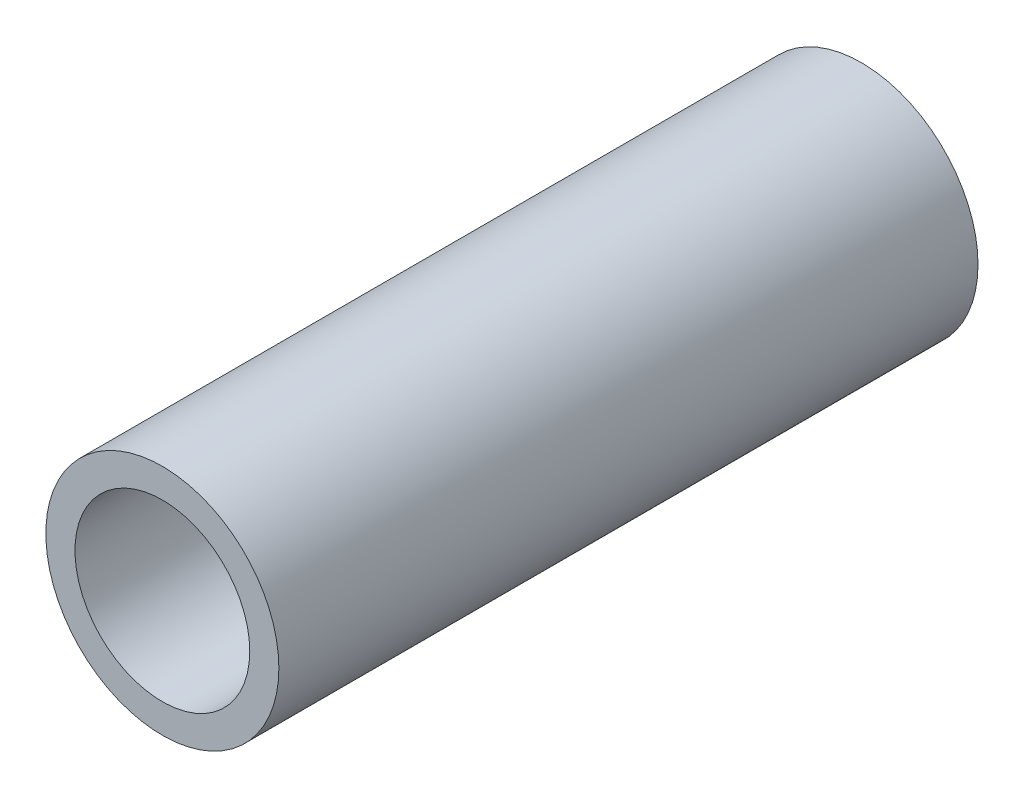
ISO-10303-21;
HEADER;
FILE_DESCRIPTION(('STEP AP214'),'2;1');
FILE_NAME('part.step','',(''),(''),'','','');
FILE_SCHEMA(('AUTOMOTIVE_DESIGN { 1 0 10303 214 1 1 1 1 }'));
ENDSEC;
DATA;
#1=APPLICATION_CONTEXT('core data for automotive mechanical design processes');
#2=APPLICATION_PROTOCOL_DEFINITION('international standard','automotive_design',2000,#1);
#3=PRODUCT_CONTEXT('',#1,'mechanical');
#4=PRODUCT('Part','Part','',(#3));
#5=PRODUCT_RELATED_PRODUCT_CATEGORY('part','',(#4));
#6=PRODUCT_DEFINITION_FORMATION('','',#4);
#7=PRODUCT_DEFINITION_CONTEXT('part definition',#1,'design');
#8=PRODUCT_DEFINITION('design','',#6,#7);
#9=PRODUCT_DEFINITION_SHAPE('','',#8);
#10=(LENGTH_UNIT() NAMED_UNIT(*) SI_UNIT(.MILLI.,.METRE.));
#11=(NAMED_UNIT(*) PLANE_ANGLE_UNIT() SI_UNIT($,.RADIAN.));
#12=(NAMED_UNIT(*) SI_UNIT($,.STERADIAN.) SOLID_ANGLE_UNIT());
#13=UNCERTAINTY_MEASURE_WITH_UNIT(LENGTH_MEASURE(1.E-05),#10,'distance_accuracy_value','');
#14=(GEOMETRIC_REPRESENTATION_CONTEXT(3) GLOBAL_UNCERTAINTY_ASSIGNED_CONTEXT((#13)) GLOBAL_UNIT_ASSIGNED_CONTEXT((#10,
#11,#12)) REPRESENTATION_CONTEXT('',''));
#15=CARTESIAN_POINT('',(0.,0.,0.));
#16=DIRECTION('',(0.,0.,1.));
#17=DIRECTION('',(1.,0.,0.));
#18=AXIS2_PLACEMENT_3D('',#15,#16,#17);
#19=CARTESIAN_POINT('',(0.,0.,24.));
#20=DIRECTION('',(0.,0.,1.));
#21=DIRECTION('',(1.,0.,0.));
#22=AXIS2_PLACEMENT_3D('',#19,#20,#21);
#23=PLANE('',#22);
#24=CARTESIAN_POINT('',(0.,0.,24.));
#25=DIRECTION('',(0.,0.,1.));
#26=DIRECTION('',(1.,0.,0.));
#27=AXIS2_PLACEMENT_3D('',#24,#25,#26);
#28=CIRCLE('',#27,4.);
#29=CARTESIAN_POINT('',(4.,0.,24.));
#30=VERTEX_POINT('',#29);
#31=EDGE_CURVE('E10',#30,#30,#28,.T.);
#32=ORIENTED_EDGE('',*,*,#31,.T.);
#33=EDGE_LOOP('',(#32));
#34=FACE_BOUND('',#33,.T.);
#35=CARTESIAN_POINT('',(0.,0.,24.));
#36=DIRECTION('',(0.,0.,1.));
#37=DIRECTION('',(1.,0.,0.));
#38=AXIS2_PLACEMENT_3D('',#35,#36,#37);
#39=CIRCLE('',#38,3.);
#40=CARTESIAN_POINT('',(3.,0.,24.));
#41=VERTEX_POINT('',#40);
#42=EDGE_CURVE('E42',#41,#41,#39,.T.);
#43=ORIENTED_EDGE('',*,*,#42,.F.);
#44=EDGE_LOOP('',(#43));
#45=FACE_BOUND('',#44,.T.);
#46=ADVANCED_FACE('F31',(#34,#45),#23,.T.);
#47=CARTESIAN_POINT('',(0.,0.,0.));
#48=DIRECTION('',(0.,0.,1.));
#49=DIRECTION('',(1.,0.,0.));
#50=AXIS2_PLACEMENT_3D('',#47,#48,#49);
#51=PLANE('',#50);
#52=CARTESIAN_POINT('',(0.,0.,0.));
#53=DIRECTION('',(0.,0.,1.));
#54=DIRECTION('',(1.,0.,0.));
#55=AXIS2_PLACEMENT_3D('',#52,#53,#54);
#56=CIRCLE('',#55,4.);
#57=CARTESIAN_POINT('',(4.,0.,0.));
#58=VERTEX_POINT('',#57);
#59=EDGE_CURVE('E35',#58,#58,#56,.T.);
#60=ORIENTED_EDGE('',*,*,#59,.F.);
#61=EDGE_LOOP('',(#60));
#62=FACE_BOUND('',#61,.T.);
#63=CARTESIAN_POINT('',(0.,0.,0.));
#64=DIRECTION('',(0.,0.,1.));
#65=DIRECTION('',(1.,0.,0.));
#66=AXIS2_PLACEMENT_3D('',#63,#64,#65);
#67=CIRCLE('',#66,3.);
#68=CARTESIAN_POINT('',(3.,0.,0.));
#69=VERTEX_POINT('',#68);
#70=EDGE_CURVE('E44',#69,#69,#67,.T.);
#71=ORIENTED_EDGE('',*,*,#70,.T.);
#72=EDGE_LOOP('',(#71));
#73=FACE_BOUND('',#72,.T.);
#74=ADVANCED_FACE('F54',(#62,#73),#51,.F.);
#75=CARTESIAN_POINT('',(0.,0.,24.));
#76=DIRECTION('',(0.,0.,-1.));
#77=DIRECTION('',(-1.,0.,0.));
#78=AXIS2_PLACEMENT_3D('',#75,#76,#77);
#79=CYLINDRICAL_SURFACE('',#78,4.);
#80=ORIENTED_EDGE('',*,*,#31,.F.);
#81=EDGE_LOOP('',(#80));
#82=FACE_BOUND('',#81,.T.);
#83=ORIENTED_EDGE('',*,*,#59,.T.);
#84=EDGE_LOOP('',(#83));
#85=FACE_BOUND('',#84,.T.);
#86=ADVANCED_FACE('F33',(#82,#85),#79,.T.);
#87=CARTESIAN_POINT('',(0.,0.,24.));
#88=DIRECTION('',(0.,0.,-1.));
#89=DIRECTION('',(-1.,0.,0.));
#90=AXIS2_PLACEMENT_3D('',#87,#88,#89);
#91=CYLINDRICAL_SURFACE('',#90,3.);
#92=ORIENTED_EDGE('',*,*,#42,.T.);
#93=EDGE_LOOP('',(#92));
#94=FACE_BOUND('',#93,.T.);
#95=ORIENTED_EDGE('',*,*,#70,.F.);
#96=EDGE_LOOP('',(#95));
#97=FACE_BOUND('',#96,.T.);
#98=ADVANCED_FACE('F50',(#94,#97),#91,.F.);
#99=CLOSED_SHELL('',(#46,#74,#86,#98));
#100=MANIFOLD_SOLID_BREP('B2',#99);
#101=ADVANCED_BREP_SHAPE_REPRESENTATION('',(#18,#100),#14);
#102=SHAPE_DEFINITION_REPRESENTATION(#9,#101);
ENDSEC;
END-ISO-10303-21;
